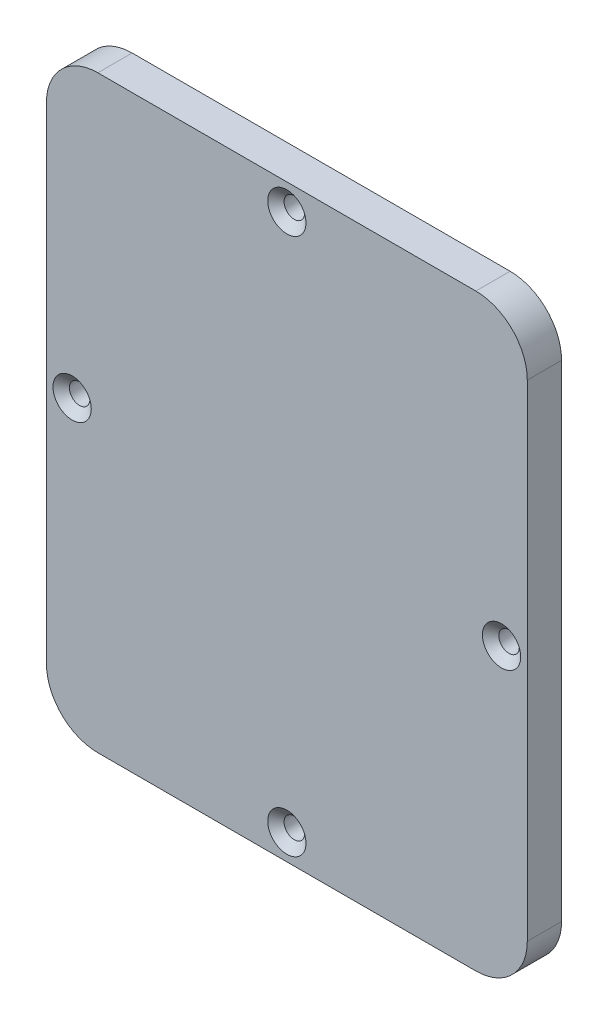
ISO-10303-21;
HEADER;
FILE_DESCRIPTION(('STEP AP214'),'2;1');
FILE_NAME('part.step','',(''),(''),'','','');
FILE_SCHEMA(('AUTOMOTIVE_DESIGN { 1 0 10303 214 1 1 1 1 }'));
ENDSEC;
DATA;
#1=APPLICATION_CONTEXT('core data for automotive mechanical design processes');
#2=APPLICATION_PROTOCOL_DEFINITION('international standard','automotive_design',2000,#1);
#3=PRODUCT_CONTEXT('',#1,'mechanical');
#4=PRODUCT('Part','Part','',(#3));
#5=PRODUCT_RELATED_PRODUCT_CATEGORY('part','',(#4));
#6=PRODUCT_DEFINITION_FORMATION('','',#4);
#7=PRODUCT_DEFINITION_CONTEXT('part definition',#1,'design');
#8=PRODUCT_DEFINITION('design','',#6,#7);
#9=PRODUCT_DEFINITION_SHAPE('','',#8);
#10=(LENGTH_UNIT() NAMED_UNIT(*) SI_UNIT(.MILLI.,.METRE.));
#11=(NAMED_UNIT(*) PLANE_ANGLE_UNIT() SI_UNIT($,.RADIAN.));
#12=(NAMED_UNIT(*) SI_UNIT($,.STERADIAN.) SOLID_ANGLE_UNIT());
#13=UNCERTAINTY_MEASURE_WITH_UNIT(LENGTH_MEASURE(1.E-05),#10,'distance_accuracy_value','');
#14=(GEOMETRIC_REPRESENTATION_CONTEXT(3) GLOBAL_UNCERTAINTY_ASSIGNED_CONTEXT((#13)) GLOBAL_UNIT_ASSIGNED_CONTEXT((#10,
#11,#12)) REPRESENTATION_CONTEXT('',''));
#15=CARTESIAN_POINT('',(0.,0.,0.));
#16=DIRECTION('',(0.,0.,1.));
#17=DIRECTION('',(1.,0.,0.));
#18=AXIS2_PLACEMENT_3D('',#15,#16,#17);
#19=CARTESIAN_POINT('',(3.175,3.175,6.35));
#20=DIRECTION('',(0.,0.,1.));
#21=DIRECTION('',(1.,0.,0.));
#22=AXIS2_PLACEMENT_3D('',#19,#20,#21);
#23=PLANE('',#22);
#24=CARTESIAN_POINT('',(-1.5875,48.175000043,6.35));
#25=DIRECTION('',(0.,0.,1.));
#26=DIRECTION('',(1.,0.,0.));
#27=AXIS2_PLACEMENT_3D('',#24,#25,#26);
#28=CIRCLE('',#27,3.5433);
#29=CARTESIAN_POINT('',(1.9558,48.175000043,6.35));
#30=VERTEX_POINT('',#29);
#31=EDGE_CURVE('E209',#30,#30,#28,.T.);
#32=ORIENTED_EDGE('',*,*,#31,.F.);
#33=EDGE_LOOP('',(#32));
#34=FACE_BOUND('',#33,.T.);
#35=CARTESIAN_POINT('',(77.937499954,48.175000043,6.35));
#36=DIRECTION('',(0.,0.,1.));
#37=DIRECTION('',(1.,0.,0.));
#38=AXIS2_PLACEMENT_3D('',#35,#36,#37);
#39=CIRCLE('',#38,3.5433);
#40=CARTESIAN_POINT('',(81.480799954,48.175000043,6.35));
#41=VERTEX_POINT('',#40);
#42=EDGE_CURVE('E200',#41,#41,#39,.T.);
#43=ORIENTED_EDGE('',*,*,#42,.F.);
#44=EDGE_LOOP('',(#43));
#45=FACE_BOUND('',#44,.T.);
#46=CARTESIAN_POINT('',(38.174999977,-1.58750000000001,6.35));
#47=DIRECTION('',(0.,0.,1.));
#48=DIRECTION('',(1.,0.,0.));
#49=AXIS2_PLACEMENT_3D('',#46,#47,#48);
#50=CIRCLE('',#49,3.5433);
#51=CARTESIAN_POINT('',(41.718299977,-1.58750000000001,6.35));
#52=VERTEX_POINT('',#51);
#53=EDGE_CURVE('E191',#52,#52,#50,.T.);
#54=ORIENTED_EDGE('',*,*,#53,.F.);
#55=EDGE_LOOP('',(#54));
#56=FACE_BOUND('',#55,.T.);
#57=CARTESIAN_POINT('',(38.174999977,97.900367712446,6.35));
#58=DIRECTION('',(0.,0.,1.));
#59=DIRECTION('',(1.,0.,0.));
#60=AXIS2_PLACEMENT_3D('',#57,#58,#59);
#61=CIRCLE('',#60,3.5433);
#62=CARTESIAN_POINT('',(41.718299977,97.900367712446,6.35));
#63=VERTEX_POINT('',#62);
#64=EDGE_CURVE('E182',#63,#63,#61,.T.);
#65=ORIENTED_EDGE('',*,*,#64,.F.);
#66=EDGE_LOOP('',(#65));
#67=FACE_BOUND('',#66,.T.);
#68=CARTESIAN_POINT('',(3.175,3.175,6.35));
#69=DIRECTION('',(0.,0.,1.));
#70=DIRECTION('',(1.,0.,0.));
#71=AXIS2_PLACEMENT_3D('',#68,#69,#70);
#72=CIRCLE('',#71,9.525);
#73=CARTESIAN_POINT('',(-6.35,3.17500000000007,6.35));
#74=VERTEX_POINT('',#73);
#75=CARTESIAN_POINT('',(3.17500000000007,-6.35,6.35));
#76=VERTEX_POINT('',#75);
#77=EDGE_CURVE('E144',#74,#76,#72,.T.);
#78=ORIENTED_EDGE('',*,*,#77,.T.);
#79=DIRECTION('',(1.,0.,0.));
#80=VECTOR('',#79,1.);
#81=CARTESIAN_POINT('',(3.17500000000007,-6.35,6.35));
#82=LINE('',#81,#80);
#83=CARTESIAN_POINT('',(73.1749999539999,-6.34999999999999,6.35));
#84=VERTEX_POINT('',#83);
#85=EDGE_CURVE('E93',#76,#84,#82,.T.);
#86=ORIENTED_EDGE('',*,*,#85,.T.);
#87=CARTESIAN_POINT('',(73.174999954,3.175,6.35));
#88=DIRECTION('',(0.,0.,1.));
#89=DIRECTION('',(1.,0.,0.));
#90=AXIS2_PLACEMENT_3D('',#87,#88,#89);
#91=CIRCLE('',#90,9.52499999999999);
#92=CARTESIAN_POINT('',(82.699999954,3.17500000000003,6.35));
#93=VERTEX_POINT('',#92);
#94=EDGE_CURVE('E159',#84,#93,#91,.T.);
#95=ORIENTED_EDGE('',*,*,#94,.T.);
#96=DIRECTION('',(0.,1.,0.));
#97=VECTOR('',#96,1.);
#98=CARTESIAN_POINT('',(82.699999954,3.17500000000003,6.35));
#99=LINE('',#98,#97);
#100=CARTESIAN_POINT('',(82.699999954,93.1750000859999,6.35));
#101=VERTEX_POINT('',#100);
#102=EDGE_CURVE('E171',#93,#101,#99,.T.);
#103=ORIENTED_EDGE('',*,*,#102,.T.);
#104=CARTESIAN_POINT('',(73.174999954,93.175000086,6.35));
#105=DIRECTION('',(0.,0.,1.));
#106=DIRECTION('',(1.,0.,0.));
#107=AXIS2_PLACEMENT_3D('',#104,#105,#106);
#108=CIRCLE('',#107,9.52499999999999);
#109=CARTESIAN_POINT('',(73.174999954,102.700000086,6.35));
#110=VERTEX_POINT('',#109);
#111=EDGE_CURVE('E111',#101,#110,#108,.T.);
#112=ORIENTED_EDGE('',*,*,#111,.T.);
#113=DIRECTION('',(-1.,0.,0.));
#114=VECTOR('',#113,1.);
#115=CARTESIAN_POINT('',(73.174999954,102.700000086,6.35));
#116=LINE('',#115,#114);
#117=CARTESIAN_POINT('',(3.175,102.700000086,6.35));
#118=VERTEX_POINT('',#117);
#119=EDGE_CURVE('E106',#110,#118,#116,.T.);
#120=ORIENTED_EDGE('',*,*,#119,.T.);
#121=CARTESIAN_POINT('',(3.175,93.175000086,6.35));
#122=DIRECTION('',(0.,0.,1.));
#123=DIRECTION('',(1.,0.,0.));
#124=AXIS2_PLACEMENT_3D('',#121,#122,#123);
#125=CIRCLE('',#124,9.52499999999999);
#126=CARTESIAN_POINT('',(-6.35,93.175000086,6.35));
#127=VERTEX_POINT('',#126);
#128=EDGE_CURVE('E109',#118,#127,#125,.T.);
#129=ORIENTED_EDGE('',*,*,#128,.T.);
#130=DIRECTION('',(0.,-1.,0.));
#131=VECTOR('',#130,1.);
#132=CARTESIAN_POINT('',(-6.35,93.175000086,6.35));
#133=LINE('',#132,#131);
#134=EDGE_CURVE('E50',#127,#74,#133,.T.);
#135=ORIENTED_EDGE('',*,*,#134,.T.);
#136=EDGE_LOOP('',(#78,#86,#95,#103,#112,#120,#129,#135));
#137=FACE_BOUND('',#136,.T.);
#138=ADVANCED_FACE('F33',(#34,#45,#56,#67,#137),#23,.T.);
#139=CARTESIAN_POINT('',(3.175,3.175,0.));
#140=DIRECTION('',(0.,0.,1.));
#141=DIRECTION('',(1.,0.,0.));
#142=AXIS2_PLACEMENT_3D('',#139,#140,#141);
#143=PLANE('',#142);
#144=CARTESIAN_POINT('',(-1.5875,48.175000043,0.));
#145=DIRECTION('',(0.,0.,1.));
#146=DIRECTION('',(1.,0.,0.));
#147=AXIS2_PLACEMENT_3D('',#144,#145,#146);
#148=CIRCLE('',#147,1.89865);
#149=CARTESIAN_POINT('',(0.311149999999997,48.175000043,0.));
#150=VERTEX_POINT('',#149);
#151=EDGE_CURVE('E203',#150,#150,#148,.T.);
#152=ORIENTED_EDGE('',*,*,#151,.T.);
#153=EDGE_LOOP('',(#152));
#154=FACE_BOUND('',#153,.T.);
#155=CARTESIAN_POINT('',(77.937499954,48.175000043,0.));
#156=DIRECTION('',(0.,0.,1.));
#157=DIRECTION('',(1.,0.,0.));
#158=AXIS2_PLACEMENT_3D('',#155,#156,#157);
#159=CIRCLE('',#158,1.89865);
#160=CARTESIAN_POINT('',(79.836149954,48.175000043,0.));
#161=VERTEX_POINT('',#160);
#162=EDGE_CURVE('E194',#161,#161,#159,.T.);
#163=ORIENTED_EDGE('',*,*,#162,.T.);
#164=EDGE_LOOP('',(#163));
#165=FACE_BOUND('',#164,.T.);
#166=CARTESIAN_POINT('',(38.174999977,-1.58750000000001,0.));
#167=DIRECTION('',(0.,0.,1.));
#168=DIRECTION('',(1.,0.,0.));
#169=AXIS2_PLACEMENT_3D('',#166,#167,#168);
#170=CIRCLE('',#169,1.89865);
#171=CARTESIAN_POINT('',(40.073649977,-1.58750000000001,0.));
#172=VERTEX_POINT('',#171);
#173=EDGE_CURVE('E185',#172,#172,#170,.T.);
#174=ORIENTED_EDGE('',*,*,#173,.T.);
#175=EDGE_LOOP('',(#174));
#176=FACE_BOUND('',#175,.T.);
#177=CARTESIAN_POINT('',(38.174999977,97.900367712446,0.));
#178=DIRECTION('',(0.,0.,1.));
#179=DIRECTION('',(1.,0.,0.));
#180=AXIS2_PLACEMENT_3D('',#177,#178,#179);
#181=CIRCLE('',#180,1.89865);
#182=CARTESIAN_POINT('',(40.073649977,97.900367712446,0.));
#183=VERTEX_POINT('',#182);
#184=EDGE_CURVE('E133',#183,#183,#181,.T.);
#185=ORIENTED_EDGE('',*,*,#184,.T.);
#186=EDGE_LOOP('',(#185));
#187=FACE_BOUND('',#186,.T.);
#188=CARTESIAN_POINT('',(3.175,3.175,0.));
#189=DIRECTION('',(0.,0.,1.));
#190=DIRECTION('',(1.,0.,0.));
#191=AXIS2_PLACEMENT_3D('',#188,#189,#190);
#192=CIRCLE('',#191,9.525);
#193=CARTESIAN_POINT('',(-6.35,3.17500000000007,0.));
#194=VERTEX_POINT('',#193);
#195=CARTESIAN_POINT('',(3.17500000000007,-6.35,0.));
#196=VERTEX_POINT('',#195);
#197=EDGE_CURVE('E129',#194,#196,#192,.T.);
#198=ORIENTED_EDGE('',*,*,#197,.F.);
#199=DIRECTION('',(0.,-1.,0.));
#200=VECTOR('',#199,1.);
#201=CARTESIAN_POINT('',(-6.35,93.175000086,0.));
#202=LINE('',#201,#200);
#203=CARTESIAN_POINT('',(-6.35,93.175000086,0.));
#204=VERTEX_POINT('',#203);
#205=EDGE_CURVE('E85',#204,#194,#202,.T.);
#206=ORIENTED_EDGE('',*,*,#205,.F.);
#207=CARTESIAN_POINT('',(3.175,93.175000086,0.));
#208=DIRECTION('',(0.,0.,1.));
#209=DIRECTION('',(1.,0.,0.));
#210=AXIS2_PLACEMENT_3D('',#207,#208,#209);
#211=CIRCLE('',#210,9.52499999999999);
#212=CARTESIAN_POINT('',(3.175,102.700000086,0.));
#213=VERTEX_POINT('',#212);
#214=EDGE_CURVE('E79',#213,#204,#211,.T.);
#215=ORIENTED_EDGE('',*,*,#214,.F.);
#216=DIRECTION('',(-1.,0.,0.));
#217=VECTOR('',#216,1.);
#218=CARTESIAN_POINT('',(73.174999954,102.700000086,0.));
#219=LINE('',#218,#217);
#220=CARTESIAN_POINT('',(73.174999954,102.700000086,0.));
#221=VERTEX_POINT('',#220);
#222=EDGE_CURVE('E119',#221,#213,#219,.T.);
#223=ORIENTED_EDGE('',*,*,#222,.F.);
#224=CARTESIAN_POINT('',(73.174999954,93.175000086,0.));
#225=DIRECTION('',(0.,0.,1.));
#226=DIRECTION('',(1.,0.,0.));
#227=AXIS2_PLACEMENT_3D('',#224,#225,#226);
#228=CIRCLE('',#227,9.52499999999999);
#229=CARTESIAN_POINT('',(82.699999954,93.1750000859999,0.));
#230=VERTEX_POINT('',#229);
#231=EDGE_CURVE('E139',#230,#221,#228,.T.);
#232=ORIENTED_EDGE('',*,*,#231,.F.);
#233=DIRECTION('',(0.,1.,0.));
#234=VECTOR('',#233,1.);
#235=CARTESIAN_POINT('',(82.699999954,3.17500000000003,0.));
#236=LINE('',#235,#234);
#237=CARTESIAN_POINT('',(82.699999954,3.17500000000003,0.));
#238=VERTEX_POINT('',#237);
#239=EDGE_CURVE('E137',#238,#230,#236,.T.);
#240=ORIENTED_EDGE('',*,*,#239,.F.);
#241=CARTESIAN_POINT('',(73.174999954,3.175,0.));
#242=DIRECTION('',(0.,0.,1.));
#243=DIRECTION('',(1.,0.,0.));
#244=AXIS2_PLACEMENT_3D('',#241,#242,#243);
#245=CIRCLE('',#244,9.52499999999999);
#246=CARTESIAN_POINT('',(73.1749999539999,-6.34999999999999,0.));
#247=VERTEX_POINT('',#246);
#248=EDGE_CURVE('E135',#247,#238,#245,.T.);
#249=ORIENTED_EDGE('',*,*,#248,.F.);
#250=DIRECTION('',(1.,0.,0.));
#251=VECTOR('',#250,1.);
#252=CARTESIAN_POINT('',(3.17500000000007,-6.35,0.));
#253=LINE('',#252,#251);
#254=EDGE_CURVE('E132',#196,#247,#253,.T.);
#255=ORIENTED_EDGE('',*,*,#254,.F.);
#256=EDGE_LOOP('',(#198,#206,#215,#223,#232,#240,#249,#255));
#257=FACE_BOUND('',#256,.T.);
#258=ADVANCED_FACE('F163',(#154,#165,#176,#187,#257),#143,.F.);
#259=CARTESIAN_POINT('',(3.175,3.175,6.35));
#260=DIRECTION('',(0.,0.,-1.));
#261=DIRECTION('',(-1.,0.,0.));
#262=AXIS2_PLACEMENT_3D('',#259,#260,#261);
#263=CYLINDRICAL_SURFACE('',#262,9.525);
#264=ORIENTED_EDGE('',*,*,#197,.T.);
#265=DIRECTION('',(0.,0.,-1.));
#266=VECTOR('',#265,1.);
#267=CARTESIAN_POINT('',(3.17500000000007,-6.35,6.35));
#268=LINE('',#267,#266);
#269=EDGE_CURVE('E11',#76,#196,#268,.T.);
#270=ORIENTED_EDGE('',*,*,#269,.F.);
#271=ORIENTED_EDGE('',*,*,#77,.F.);
#272=DIRECTION('',(0.,0.,-1.));
#273=VECTOR('',#272,1.);
#274=CARTESIAN_POINT('',(-6.35,3.17500000000007,6.35));
#275=LINE('',#274,#273);
#276=EDGE_CURVE('E125',#74,#194,#275,.T.);
#277=ORIENTED_EDGE('',*,*,#276,.T.);
#278=EDGE_LOOP('',(#264,#270,#271,#277));
#279=FACE_BOUND('',#278,.T.);
#280=ADVANCED_FACE('F35',(#279),#263,.T.);
#281=CARTESIAN_POINT('',(3.17500000000007,-6.35,6.35));
#282=DIRECTION('',(0.,1.,0.));
#283=DIRECTION('',(-1.,0.,0.));
#284=AXIS2_PLACEMENT_3D('',#281,#282,#283);
#285=PLANE('',#284);
#286=ORIENTED_EDGE('',*,*,#254,.T.);
#287=DIRECTION('',(0.,0.,-1.));
#288=VECTOR('',#287,1.);
#289=CARTESIAN_POINT('',(73.1749999539999,-6.34999999999999,6.35));
#290=LINE('',#289,#288);
#291=EDGE_CURVE('E42',#84,#247,#290,.T.);
#292=ORIENTED_EDGE('',*,*,#291,.F.);
#293=ORIENTED_EDGE('',*,*,#85,.F.);
#294=ORIENTED_EDGE('',*,*,#269,.T.);
#295=EDGE_LOOP('',(#286,#292,#293,#294));
#296=FACE_BOUND('',#295,.T.);
#297=ADVANCED_FACE('F257',(#296),#285,.F.);
#298=CARTESIAN_POINT('',(73.174999954,3.175,6.35));
#299=DIRECTION('',(0.,0.,-1.));
#300=DIRECTION('',(-1.,0.,0.));
#301=AXIS2_PLACEMENT_3D('',#298,#299,#300);
#302=CYLINDRICAL_SURFACE('',#301,9.52499999999999);
#303=ORIENTED_EDGE('',*,*,#248,.T.);
#304=DIRECTION('',(0.,0.,-1.));
#305=VECTOR('',#304,1.);
#306=CARTESIAN_POINT('',(82.699999954,3.17500000000003,6.35));
#307=LINE('',#306,#305);
#308=EDGE_CURVE('E151',#93,#238,#307,.T.);
#309=ORIENTED_EDGE('',*,*,#308,.F.);
#310=ORIENTED_EDGE('',*,*,#94,.F.);
#311=ORIENTED_EDGE('',*,*,#291,.T.);
#312=EDGE_LOOP('',(#303,#309,#310,#311));
#313=FACE_BOUND('',#312,.T.);
#314=ADVANCED_FACE('F157',(#313),#302,.T.);
#315=CARTESIAN_POINT('',(82.699999954,3.17500000000003,6.35));
#316=DIRECTION('',(-1.,0.,0.));
#317=DIRECTION('',(0.,0.,1.));
#318=AXIS2_PLACEMENT_3D('',#315,#316,#317);
#319=PLANE('',#318);
#320=ORIENTED_EDGE('',*,*,#239,.T.);
#321=DIRECTION('',(0.,0.,-1.));
#322=VECTOR('',#321,1.);
#323=CARTESIAN_POINT('',(82.699999954,93.1750000859999,6.35));
#324=LINE('',#323,#322);
#325=EDGE_CURVE('E148',#101,#230,#324,.T.);
#326=ORIENTED_EDGE('',*,*,#325,.F.);
#327=ORIENTED_EDGE('',*,*,#102,.F.);
#328=ORIENTED_EDGE('',*,*,#308,.T.);
#329=EDGE_LOOP('',(#320,#326,#327,#328));
#330=FACE_BOUND('',#329,.T.);
#331=ADVANCED_FACE('F167',(#330),#319,.F.);
#332=CARTESIAN_POINT('',(73.174999954,93.175000086,6.35));
#333=DIRECTION('',(0.,0.,-1.));
#334=DIRECTION('',(-1.,0.,0.));
#335=AXIS2_PLACEMENT_3D('',#332,#333,#334);
#336=CYLINDRICAL_SURFACE('',#335,9.52499999999999);
#337=ORIENTED_EDGE('',*,*,#231,.T.);
#338=DIRECTION('',(0.,0.,-1.));
#339=VECTOR('',#338,1.);
#340=CARTESIAN_POINT('',(73.174999954,102.700000086,6.35));
#341=LINE('',#340,#339);
#342=EDGE_CURVE('E120',#110,#221,#341,.T.);
#343=ORIENTED_EDGE('',*,*,#342,.F.);
#344=ORIENTED_EDGE('',*,*,#111,.F.);
#345=ORIENTED_EDGE('',*,*,#325,.T.);
#346=EDGE_LOOP('',(#337,#343,#344,#345));
#347=FACE_BOUND('',#346,.T.);
#348=ADVANCED_FACE('F170',(#347),#336,.T.);
#349=CARTESIAN_POINT('',(73.174999954,102.700000086,6.35));
#350=DIRECTION('',(0.,-1.,0.));
#351=DIRECTION('',(0.,0.,-1.));
#352=AXIS2_PLACEMENT_3D('',#349,#350,#351);
#353=PLANE('',#352);
#354=ORIENTED_EDGE('',*,*,#222,.T.);
#355=DIRECTION('',(0.,0.,-1.));
#356=VECTOR('',#355,1.);
#357=CARTESIAN_POINT('',(3.175,102.700000086,6.35));
#358=LINE('',#357,#356);
#359=EDGE_CURVE('E116',#118,#213,#358,.T.);
#360=ORIENTED_EDGE('',*,*,#359,.F.);
#361=ORIENTED_EDGE('',*,*,#119,.F.);
#362=ORIENTED_EDGE('',*,*,#342,.T.);
#363=EDGE_LOOP('',(#354,#360,#361,#362));
#364=FACE_BOUND('',#363,.T.);
#365=ADVANCED_FACE('F117',(#364),#353,.F.);
#366=CARTESIAN_POINT('',(3.175,93.175000086,6.35));
#367=DIRECTION('',(0.,0.,-1.));
#368=DIRECTION('',(-1.,0.,0.));
#369=AXIS2_PLACEMENT_3D('',#366,#367,#368);
#370=CYLINDRICAL_SURFACE('',#369,9.52499999999999);
#371=ORIENTED_EDGE('',*,*,#214,.T.);
#372=DIRECTION('',(0.,0.,-1.));
#373=VECTOR('',#372,1.);
#374=CARTESIAN_POINT('',(-6.35,93.175000086,6.35));
#375=LINE('',#374,#373);
#376=EDGE_CURVE('E121',#127,#204,#375,.T.);
#377=ORIENTED_EDGE('',*,*,#376,.F.);
#378=ORIENTED_EDGE('',*,*,#128,.F.);
#379=ORIENTED_EDGE('',*,*,#359,.T.);
#380=EDGE_LOOP('',(#371,#377,#378,#379));
#381=FACE_BOUND('',#380,.T.);
#382=ADVANCED_FACE('F123',(#381),#370,.T.);
#383=CARTESIAN_POINT('',(-6.35,93.175000086,6.35));
#384=DIRECTION('',(1.,0.,0.));
#385=DIRECTION('',(0.,1.,0.));
#386=AXIS2_PLACEMENT_3D('',#383,#384,#385);
#387=PLANE('',#386);
#388=ORIENTED_EDGE('',*,*,#205,.T.);
#389=ORIENTED_EDGE('',*,*,#276,.F.);
#390=ORIENTED_EDGE('',*,*,#134,.F.);
#391=ORIENTED_EDGE('',*,*,#376,.T.);
#392=EDGE_LOOP('',(#388,#389,#390,#391));
#393=FACE_BOUND('',#392,.T.);
#394=ADVANCED_FACE('F237',(#393),#387,.F.);
#395=CARTESIAN_POINT('',(38.174999977,97.900367712446,6.35));
#396=DIRECTION('',(0.,0.,1.));
#397=DIRECTION('',(1.,0.,0.));
#398=AXIS2_PLACEMENT_3D('',#395,#396,#397);
#399=CYLINDRICAL_SURFACE('',#398,1.89865);
#400=ORIENTED_EDGE('',*,*,#184,.F.);
#401=EDGE_LOOP('',(#400));
#402=FACE_BOUND('',#401,.T.);
#403=CARTESIAN_POINT('',(38.174999977,97.900367712446,4.96997479158429));
#404=DIRECTION('',(0.,0.,1.));
#405=DIRECTION('',(1.,0.,0.));
#406=AXIS2_PLACEMENT_3D('',#403,#404,#405);
#407=CIRCLE('',#406,1.89865);
#408=CARTESIAN_POINT('',(40.073649977,97.900367712446,4.96997479158429));
#409=VERTEX_POINT('',#408);
#410=EDGE_CURVE('E179',#409,#409,#407,.T.);
#411=ORIENTED_EDGE('',*,*,#410,.T.);
#412=EDGE_LOOP('',(#411));
#413=FACE_BOUND('',#412,.T.);
#414=ADVANCED_FACE('F227',(#402,#413),#399,.F.);
#415=CARTESIAN_POINT('',(38.174999977,97.900367712446,6.35));
#416=DIRECTION('',(0.,0.,1.));
#417=DIRECTION('',(1.,0.,0.));
#418=AXIS2_PLACEMENT_3D('',#415,#416,#417);
#419=CONICAL_SURFACE('',#418,3.5433,0.872664625997164);
#420=ORIENTED_EDGE('',*,*,#410,.F.);
#421=EDGE_LOOP('',(#420));
#422=FACE_BOUND('',#421,.T.);
#423=ORIENTED_EDGE('',*,*,#64,.T.);
#424=EDGE_LOOP('',(#423));
#425=FACE_BOUND('',#424,.T.);
#426=ADVANCED_FACE('F224',(#422,#425),#419,.F.);
#427=CARTESIAN_POINT('',(38.174999977,-1.58750000000001,6.35));
#428=DIRECTION('',(0.,0.,1.));
#429=DIRECTION('',(1.,0.,0.));
#430=AXIS2_PLACEMENT_3D('',#427,#428,#429);
#431=CYLINDRICAL_SURFACE('',#430,1.89865);
#432=ORIENTED_EDGE('',*,*,#173,.F.);
#433=EDGE_LOOP('',(#432));
#434=FACE_BOUND('',#433,.T.);
#435=CARTESIAN_POINT('',(38.174999977,-1.58750000000001,4.96997479158429));
#436=DIRECTION('',(0.,0.,1.));
#437=DIRECTION('',(1.,0.,0.));
#438=AXIS2_PLACEMENT_3D('',#435,#436,#437);
#439=CIRCLE('',#438,1.89865);
#440=CARTESIAN_POINT('',(40.073649977,-1.58750000000001,4.96997479158429));
#441=VERTEX_POINT('',#440);
#442=EDGE_CURVE('E188',#441,#441,#439,.T.);
#443=ORIENTED_EDGE('',*,*,#442,.T.);
#444=EDGE_LOOP('',(#443));
#445=FACE_BOUND('',#444,.T.);
#446=ADVANCED_FACE('F226',(#434,#445),#431,.F.);
#447=CARTESIAN_POINT('',(38.174999977,-1.58750000000001,6.35));
#448=DIRECTION('',(0.,0.,1.));
#449=DIRECTION('',(1.,0.,0.));
#450=AXIS2_PLACEMENT_3D('',#447,#448,#449);
#451=CONICAL_SURFACE('',#450,3.5433,0.872664625997164);
#452=ORIENTED_EDGE('',*,*,#442,.F.);
#453=EDGE_LOOP('',(#452));
#454=FACE_BOUND('',#453,.T.);
#455=ORIENTED_EDGE('',*,*,#53,.T.);
#456=EDGE_LOOP('',(#455));
#457=FACE_BOUND('',#456,.T.);
#458=ADVANCED_FACE('F234',(#454,#457),#451,.F.);
#459=CARTESIAN_POINT('',(77.937499954,48.175000043,6.35));
#460=DIRECTION('',(0.,0.,1.));
#461=DIRECTION('',(1.,0.,0.));
#462=AXIS2_PLACEMENT_3D('',#459,#460,#461);
#463=CYLINDRICAL_SURFACE('',#462,1.89865);
#464=ORIENTED_EDGE('',*,*,#162,.F.);
#465=EDGE_LOOP('',(#464));
#466=FACE_BOUND('',#465,.T.);
#467=CARTESIAN_POINT('',(77.937499954,48.175000043,4.96997479158429));
#468=DIRECTION('',(0.,0.,1.));
#469=DIRECTION('',(1.,0.,0.));
#470=AXIS2_PLACEMENT_3D('',#467,#468,#469);
#471=CIRCLE('',#470,1.89865);
#472=CARTESIAN_POINT('',(79.836149954,48.175000043,4.96997479158429));
#473=VERTEX_POINT('',#472);
#474=EDGE_CURVE('E197',#473,#473,#471,.T.);
#475=ORIENTED_EDGE('',*,*,#474,.T.);
#476=EDGE_LOOP('',(#475));
#477=FACE_BOUND('',#476,.T.);
#478=ADVANCED_FACE('F344',(#466,#477),#463,.F.);
#479=CARTESIAN_POINT('',(77.937499954,48.175000043,6.35));
#480=DIRECTION('',(0.,0.,1.));
#481=DIRECTION('',(1.,0.,0.));
#482=AXIS2_PLACEMENT_3D('',#479,#480,#481);
#483=CONICAL_SURFACE('',#482,3.5433,0.872664625997164);
#484=ORIENTED_EDGE('',*,*,#474,.F.);
#485=EDGE_LOOP('',(#484));
#486=FACE_BOUND('',#485,.T.);
#487=ORIENTED_EDGE('',*,*,#42,.T.);
#488=EDGE_LOOP('',(#487));
#489=FACE_BOUND('',#488,.T.);
#490=ADVANCED_FACE('F353',(#486,#489),#483,.F.);
#491=CARTESIAN_POINT('',(-1.5875,48.175000043,6.35));
#492=DIRECTION('',(0.,0.,1.));
#493=DIRECTION('',(1.,0.,0.));
#494=AXIS2_PLACEMENT_3D('',#491,#492,#493);
#495=CYLINDRICAL_SURFACE('',#494,1.89865);
#496=ORIENTED_EDGE('',*,*,#151,.F.);
#497=EDGE_LOOP('',(#496));
#498=FACE_BOUND('',#497,.T.);
#499=CARTESIAN_POINT('',(-1.5875,48.175000043,4.96997479158429));
#500=DIRECTION('',(0.,0.,1.));
#501=DIRECTION('',(1.,0.,0.));
#502=AXIS2_PLACEMENT_3D('',#499,#500,#501);
#503=CIRCLE('',#502,1.89865);
#504=CARTESIAN_POINT('',(0.311149999999996,48.175000043,4.96997479158429));
#505=VERTEX_POINT('',#504);
#506=EDGE_CURVE('E206',#505,#505,#503,.T.);
#507=ORIENTED_EDGE('',*,*,#506,.T.);
#508=EDGE_LOOP('',(#507));
#509=FACE_BOUND('',#508,.T.);
#510=ADVANCED_FACE('F363',(#498,#509),#495,.F.);
#511=CARTESIAN_POINT('',(-1.5875,48.175000043,6.35));
#512=DIRECTION('',(0.,0.,1.));
#513=DIRECTION('',(1.,0.,0.));
#514=AXIS2_PLACEMENT_3D('',#511,#512,#513);
#515=CONICAL_SURFACE('',#514,3.5433,0.872664625997165);
#516=ORIENTED_EDGE('',*,*,#506,.F.);
#517=EDGE_LOOP('',(#516));
#518=FACE_BOUND('',#517,.T.);
#519=ORIENTED_EDGE('',*,*,#31,.T.);
#520=EDGE_LOOP('',(#519));
#521=FACE_BOUND('',#520,.T.);
#522=ADVANCED_FACE('F213',(#518,#521),#515,.F.);
#523=CLOSED_SHELL('',(#138,#258,#280,#297,#314,#331,#348,#365,#382,#394,#414,#426,#446,#458,
#478,#490,#510,#522));
#524=MANIFOLD_SOLID_BREP('B2',#523);
#525=ADVANCED_BREP_SHAPE_REPRESENTATION('',(#18,#524),#14);
#526=SHAPE_DEFINITION_REPRESENTATION(#9,#525);
ENDSEC;
END-ISO-10303-21;
